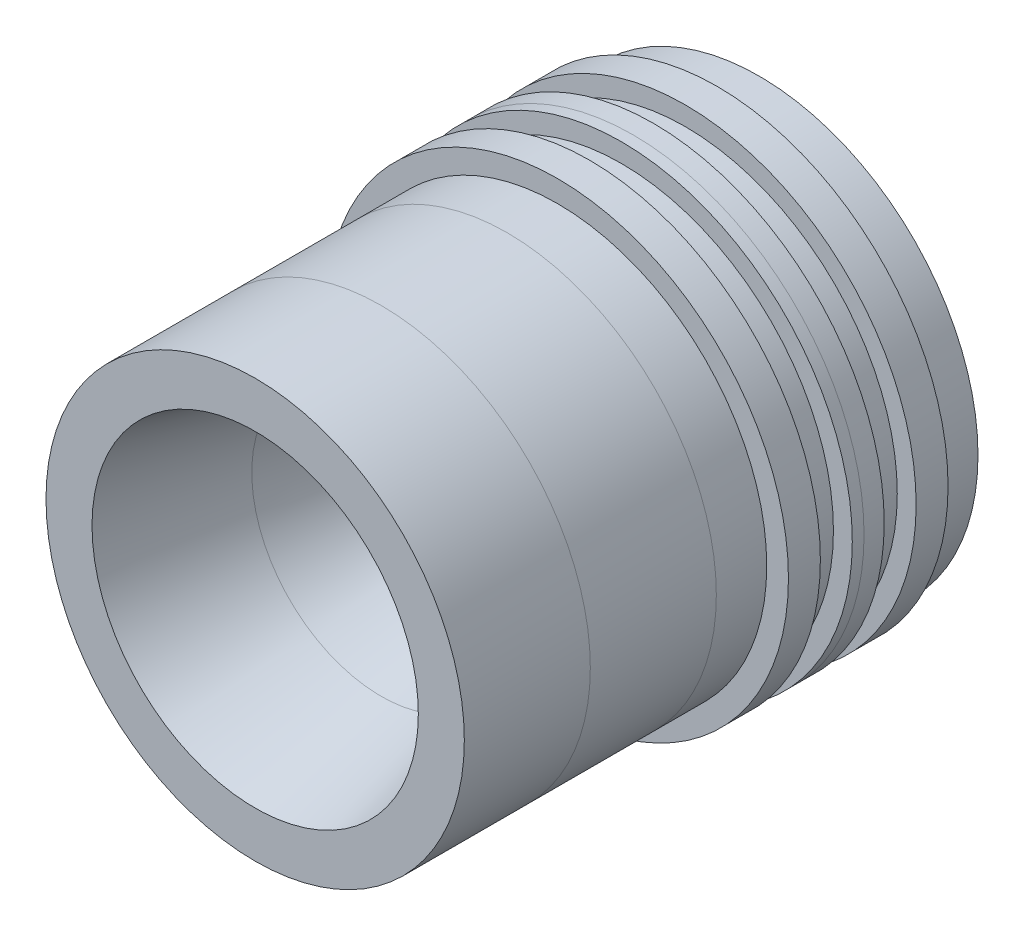
ISO-10303-21;
HEADER;
FILE_DESCRIPTION(('STEP AP214'),'2;1');
FILE_NAME('part.step','',(''),(''),'','','');
FILE_SCHEMA(('AUTOMOTIVE_DESIGN { 1 0 10303 214 1 1 1 1 }'));
ENDSEC;
DATA;
#1=APPLICATION_CONTEXT('core data for automotive mechanical design processes');
#2=APPLICATION_PROTOCOL_DEFINITION('international standard','automotive_design',2000,#1);
#3=PRODUCT_CONTEXT('',#1,'mechanical');
#4=PRODUCT('Part','Part','',(#3));
#5=PRODUCT_RELATED_PRODUCT_CATEGORY('part','',(#4));
#6=PRODUCT_DEFINITION_FORMATION('','',#4);
#7=PRODUCT_DEFINITION_CONTEXT('part definition',#1,'design');
#8=PRODUCT_DEFINITION('design','',#6,#7);
#9=PRODUCT_DEFINITION_SHAPE('','',#8);
#10=(LENGTH_UNIT() NAMED_UNIT(*) SI_UNIT(.MILLI.,.METRE.));
#11=(NAMED_UNIT(*) PLANE_ANGLE_UNIT() SI_UNIT($,.RADIAN.));
#12=(NAMED_UNIT(*) SI_UNIT($,.STERADIAN.) SOLID_ANGLE_UNIT());
#13=UNCERTAINTY_MEASURE_WITH_UNIT(LENGTH_MEASURE(1.E-05),#10,'distance_accuracy_value','');
#14=(GEOMETRIC_REPRESENTATION_CONTEXT(3) GLOBAL_UNCERTAINTY_ASSIGNED_CONTEXT((#13)) GLOBAL_UNIT_ASSIGNED_CONTEXT((#10,
#11,#12)) REPRESENTATION_CONTEXT('',''));
#15=CARTESIAN_POINT('',(0.,0.,0.));
#16=DIRECTION('',(0.,0.,1.));
#17=DIRECTION('',(1.,0.,0.));
#18=AXIS2_PLACEMENT_3D('',#15,#16,#17);
#19=CARTESIAN_POINT('',(0.,0.,-114.3));
#20=DIRECTION('',(0.,0.,1.));
#21=DIRECTION('',(1.,0.,0.));
#22=AXIS2_PLACEMENT_3D('',#19,#20,#21);
#23=PLANE('',#22);
#24=CARTESIAN_POINT('',(0.,0.,-114.3));
#25=DIRECTION('',(0.,0.,1.));
#26=DIRECTION('',(1.,0.,0.));
#27=AXIS2_PLACEMENT_3D('',#24,#25,#26);
#28=CIRCLE('',#27,44.45);
#29=CARTESIAN_POINT('',(44.45,0.,-114.3));
#30=VERTEX_POINT('',#29);
#31=EDGE_CURVE('E57',#30,#30,#28,.F.);
#32=ORIENTED_EDGE('',*,*,#31,.T.);
#33=EDGE_LOOP('',(#32));
#34=FACE_BOUND('',#33,.T.);
#35=CARTESIAN_POINT('',(0.,0.,-114.3));
#36=DIRECTION('',(0.,0.,1.));
#37=DIRECTION('',(1.,0.,0.));
#38=AXIS2_PLACEMENT_3D('',#35,#36,#37);
#39=CIRCLE('',#38,69.8119);
#40=CARTESIAN_POINT('',(69.8119,0.,-114.3));
#41=VERTEX_POINT('',#40);
#42=EDGE_CURVE('E80',#41,#41,#39,.F.);
#43=ORIENTED_EDGE('',*,*,#42,.F.);
#44=EDGE_LOOP('',(#43));
#45=FACE_BOUND('',#44,.T.);
#46=ADVANCED_FACE('F53',(#34,#45),#23,.T.);
#47=CARTESIAN_POINT('',(0.,0.,8.14522565701556));
#48=DIRECTION('',(0.,0.,1.));
#49=DIRECTION('',(1.,0.,0.));
#50=AXIS2_PLACEMENT_3D('',#47,#48,#49);
#51=CYLINDRICAL_SURFACE('',#50,69.8119);
#52=CARTESIAN_POINT('',(0.,0.,-130.048));
#53=DIRECTION('',(0.,0.,-1.));
#54=DIRECTION('',(-1.,0.,0.));
#55=AXIS2_PLACEMENT_3D('',#52,#53,#54);
#56=CIRCLE('',#55,69.8119);
#57=CARTESIAN_POINT('',(-69.8119,0.,-130.048));
#58=VERTEX_POINT('',#57);
#59=EDGE_CURVE('E72',#58,#58,#56,.F.);
#60=ORIENTED_EDGE('',*,*,#59,.F.);
#61=EDGE_LOOP('',(#60));
#62=FACE_BOUND('',#61,.T.);
#63=CARTESIAN_POINT('',(0.,0.,-139.7));
#64=DIRECTION('',(0.,0.,1.));
#65=DIRECTION('',(1.,0.,0.));
#66=AXIS2_PLACEMENT_3D('',#63,#64,#65);
#67=CIRCLE('',#66,69.8119);
#68=CARTESIAN_POINT('',(69.8119,0.,-139.7));
#69=VERTEX_POINT('',#68);
#70=EDGE_CURVE('E76',#69,#69,#67,.T.);
#71=ORIENTED_EDGE('',*,*,#70,.T.);
#72=EDGE_LOOP('',(#71));
#73=FACE_BOUND('',#72,.T.);
#74=ADVANCED_FACE('F55',(#62,#73),#51,.T.);
#75=CARTESIAN_POINT('',(64.1096,0.,-130.048));
#76=DIRECTION('',(0.,0.,-1.));
#77=DIRECTION('',(-1.,0.,0.));
#78=AXIS2_PLACEMENT_3D('',#75,#76,#77);
#79=PLANE('',#78);
#80=ORIENTED_EDGE('',*,*,#59,.T.);
#81=EDGE_LOOP('',(#80));
#82=FACE_BOUND('',#81,.T.);
#83=CARTESIAN_POINT('',(0.,0.,-130.048));
#84=DIRECTION('',(0.,0.,1.));
#85=DIRECTION('',(1.,0.,0.));
#86=AXIS2_PLACEMENT_3D('',#83,#84,#85);
#87=CIRCLE('',#86,64.1096);
#88=CARTESIAN_POINT('',(64.1096,0.,-130.048));
#89=VERTEX_POINT('',#88);
#90=EDGE_CURVE('E61',#89,#89,#87,.T.);
#91=ORIENTED_EDGE('',*,*,#90,.F.);
#92=EDGE_LOOP('',(#91));
#93=FACE_BOUND('',#92,.T.);
#94=ADVANCED_FACE('F109',(#82,#93),#79,.F.);
#95=CARTESIAN_POINT('',(0.,0.,8.14522565701556));
#96=DIRECTION('',(0.,0.,1.));
#97=DIRECTION('',(1.,0.,0.));
#98=AXIS2_PLACEMENT_3D('',#95,#96,#97);
#99=CYLINDRICAL_SURFACE('',#98,64.1096);
#100=CARTESIAN_POINT('',(0.,0.,-120.396));
#101=DIRECTION('',(0.,0.,1.));
#102=DIRECTION('',(1.,0.,0.));
#103=AXIS2_PLACEMENT_3D('',#100,#101,#102);
#104=CIRCLE('',#103,64.1096);
#105=CARTESIAN_POINT('',(64.1096,0.,-120.396));
#106=VERTEX_POINT('',#105);
#107=EDGE_CURVE('E66',#106,#106,#104,.T.);
#108=ORIENTED_EDGE('',*,*,#107,.F.);
#109=EDGE_LOOP('',(#108));
#110=FACE_BOUND('',#109,.T.);
#111=ORIENTED_EDGE('',*,*,#90,.T.);
#112=EDGE_LOOP('',(#111));
#113=FACE_BOUND('',#112,.T.);
#114=ADVANCED_FACE('F115',(#110,#113),#99,.T.);
#115=CARTESIAN_POINT('',(64.1096,0.,-120.396));
#116=DIRECTION('',(0.,0.,1.));
#117=DIRECTION('',(1.,0.,0.));
#118=AXIS2_PLACEMENT_3D('',#115,#116,#117);
#119=PLANE('',#118);
#120=CARTESIAN_POINT('',(0.,0.,-120.396));
#121=DIRECTION('',(0.,0.,1.));
#122=DIRECTION('',(1.,0.,0.));
#123=AXIS2_PLACEMENT_3D('',#120,#121,#122);
#124=CIRCLE('',#123,69.8119);
#125=CARTESIAN_POINT('',(69.8119,0.,-120.396));
#126=VERTEX_POINT('',#125);
#127=EDGE_CURVE('E69',#126,#126,#124,.F.);
#128=ORIENTED_EDGE('',*,*,#127,.T.);
#129=EDGE_LOOP('',(#128));
#130=FACE_BOUND('',#129,.T.);
#131=ORIENTED_EDGE('',*,*,#107,.T.);
#132=EDGE_LOOP('',(#131));
#133=FACE_BOUND('',#132,.T.);
#134=ADVANCED_FACE('F122',(#130,#133),#119,.F.);
#135=ORIENTED_EDGE('',*,*,#127,.F.);
#136=EDGE_LOOP('',(#135));
#137=FACE_BOUND('',#136,.T.);
#138=ORIENTED_EDGE('',*,*,#42,.T.);
#139=EDGE_LOOP('',(#138));
#140=FACE_BOUND('',#139,.T.);
#141=ADVANCED_FACE('F111',(#137,#140),#51,.T.);
#142=CARTESIAN_POINT('',(69.8119,0.,-139.7));
#143=DIRECTION('',(0.,0.,-1.));
#144=DIRECTION('',(-1.,0.,0.));
#145=AXIS2_PLACEMENT_3D('',#142,#143,#144);
#146=PLANE('',#145);
#147=CARTESIAN_POINT('',(0.,0.,-139.7));
#148=DIRECTION('',(0.,0.,1.));
#149=DIRECTION('',(1.,0.,0.));
#150=AXIS2_PLACEMENT_3D('',#147,#148,#149);
#151=CIRCLE('',#150,66.167);
#152=CARTESIAN_POINT('',(66.167,0.,-139.7));
#153=VERTEX_POINT('',#152);
#154=EDGE_CURVE('E73',#153,#153,#151,.T.);
#155=ORIENTED_EDGE('',*,*,#154,.T.);
#156=EDGE_LOOP('',(#155));
#157=FACE_BOUND('',#156,.T.);
#158=ORIENTED_EDGE('',*,*,#70,.F.);
#159=EDGE_LOOP('',(#158));
#160=FACE_BOUND('',#159,.T.);
#161=ADVANCED_FACE('F121',(#157,#160),#146,.T.);
#162=CARTESIAN_POINT('',(0.,0.,8.14522565701556));
#163=DIRECTION('',(0.,0.,1.));
#164=DIRECTION('',(1.,0.,0.));
#165=AXIS2_PLACEMENT_3D('',#162,#163,#164);
#166=CYLINDRICAL_SURFACE('',#165,66.167);
#167=CARTESIAN_POINT('',(0.,0.,-152.4));
#168=DIRECTION('',(0.,0.,1.));
#169=DIRECTION('',(1.,0.,0.));
#170=AXIS2_PLACEMENT_3D('',#167,#168,#169);
#171=CIRCLE('',#170,66.167);
#172=CARTESIAN_POINT('',(66.167,0.,-152.4));
#173=VERTEX_POINT('',#172);
#174=EDGE_CURVE('E83',#173,#173,#171,.T.);
#175=ORIENTED_EDGE('',*,*,#174,.T.);
#176=EDGE_LOOP('',(#175));
#177=FACE_BOUND('',#176,.T.);
#178=ORIENTED_EDGE('',*,*,#154,.F.);
#179=EDGE_LOOP('',(#178));
#180=FACE_BOUND('',#179,.T.);
#181=ADVANCED_FACE('F128',(#177,#180),#166,.T.);
#182=CARTESIAN_POINT('',(66.167,0.,-152.4));
#183=DIRECTION('',(0.,0.,-1.));
#184=DIRECTION('',(-1.,0.,0.));
#185=AXIS2_PLACEMENT_3D('',#182,#183,#184);
#186=PLANE('',#185);
#187=CARTESIAN_POINT('',(0.,0.,-152.4));
#188=DIRECTION('',(0.,0.,1.));
#189=DIRECTION('',(1.,0.,0.));
#190=AXIS2_PLACEMENT_3D('',#187,#188,#189);
#191=CIRCLE('',#190,59.817);
#192=CARTESIAN_POINT('',(59.817,0.,-152.4));
#193=VERTEX_POINT('',#192);
#194=EDGE_CURVE('E79',#193,#193,#191,.T.);
#195=ORIENTED_EDGE('',*,*,#194,.T.);
#196=EDGE_LOOP('',(#195));
#197=FACE_BOUND('',#196,.T.);
#198=ORIENTED_EDGE('',*,*,#174,.F.);
#199=EDGE_LOOP('',(#198));
#200=FACE_BOUND('',#199,.T.);
#201=ADVANCED_FACE('F103',(#197,#200),#186,.T.);
#202=CARTESIAN_POINT('',(0.,0.,-152.4));
#203=DIRECTION('',(0.,0.,-1.));
#204=DIRECTION('',(-1.,0.,0.));
#205=AXIS2_PLACEMENT_3D('',#202,#203,#204);
#206=CONICAL_SURFACE('',#205,59.817,1.0471975511966);
#207=CARTESIAN_POINT('',(0.,0.,-143.527858413363));
#208=DIRECTION('',(0.,0.,-1.));
#209=DIRECTION('',(-1.,0.,0.));
#210=AXIS2_PLACEMENT_3D('',#207,#208,#209);
#211=CIRCLE('',#210,44.45);
#212=CARTESIAN_POINT('',(-44.45,0.,-143.527858413363));
#213=VERTEX_POINT('',#212);
#214=EDGE_CURVE('E12',#213,#213,#211,.T.);
#215=ORIENTED_EDGE('',*,*,#214,.F.);
#216=EDGE_LOOP('',(#215));
#217=FACE_BOUND('',#216,.T.);
#218=ORIENTED_EDGE('',*,*,#194,.F.);
#219=EDGE_LOOP('',(#218));
#220=FACE_BOUND('',#219,.T.);
#221=ADVANCED_FACE('F99',(#217,#220),#206,.F.);
#222=CARTESIAN_POINT('',(0.,0.,8.14522565701556));
#223=DIRECTION('',(0.,0.,1.));
#224=DIRECTION('',(1.,0.,0.));
#225=AXIS2_PLACEMENT_3D('',#222,#223,#224);
#226=CYLINDRICAL_SURFACE('',#225,44.45);
#227=ORIENTED_EDGE('',*,*,#214,.T.);
#228=EDGE_LOOP('',(#227));
#229=FACE_BOUND('',#228,.T.);
#230=ORIENTED_EDGE('',*,*,#31,.F.);
#231=EDGE_LOOP('',(#230));
#232=FACE_BOUND('',#231,.T.);
#233=ADVANCED_FACE('F97',(#229,#232),#226,.F.);
#234=CLOSED_SHELL('',(#46,#74,#94,#114,#134,#141,#161,#181,#201,#221,#233));
#235=MANIFOLD_SOLID_BREP('B2',#234);
#236=CARTESIAN_POINT('',(0.,0.,-76.2));
#237=DIRECTION('',(0.,0.,1.));
#238=DIRECTION('',(1.,0.,0.));
#239=AXIS2_PLACEMENT_3D('',#236,#237,#238);
#240=PLANE('',#239);
#241=CARTESIAN_POINT('',(0.,0.,-76.2));
#242=DIRECTION('',(0.,0.,1.));
#243=DIRECTION('',(1.,0.,0.));
#244=AXIS2_PLACEMENT_3D('',#241,#242,#243);
#245=CIRCLE('',#244,63.246);
#246=CARTESIAN_POINT('',(63.246,0.,-76.2));
#247=VERTEX_POINT('',#246);
#248=EDGE_CURVE('E248',#247,#247,#245,.F.);
#249=ORIENTED_EDGE('',*,*,#248,.T.);
#250=EDGE_LOOP('',(#249));
#251=FACE_BOUND('',#250,.T.);
#252=CARTESIAN_POINT('',(0.,0.,-76.2));
#253=DIRECTION('',(0.,0.,1.));
#254=DIRECTION('',(1.,0.,0.));
#255=AXIS2_PLACEMENT_3D('',#252,#253,#254);
#256=CIRCLE('',#255,28.919574243207);
#257=CARTESIAN_POINT('',(28.919574243207,0.,-76.2));
#258=VERTEX_POINT('',#257);
#259=EDGE_CURVE('E253',#258,#258,#256,.T.);
#260=ORIENTED_EDGE('',*,*,#259,.T.);
#261=EDGE_LOOP('',(#260));
#262=FACE_BOUND('',#261,.T.);
#263=ADVANCED_FACE('F235',(#251,#262),#240,.F.);
#264=CARTESIAN_POINT('',(0.,0.,-38.1));
#265=DIRECTION('',(0.,0.,1.));
#266=DIRECTION('',(1.,0.,0.));
#267=AXIS2_PLACEMENT_3D('',#264,#265,#266);
#268=PLANE('',#267);
#269=CARTESIAN_POINT('',(0.,0.,-38.1));
#270=DIRECTION('',(0.,0.,1.));
#271=DIRECTION('',(1.,0.,0.));
#272=AXIS2_PLACEMENT_3D('',#269,#270,#271);
#273=CIRCLE('',#272,39.1284384748328);
#274=CARTESIAN_POINT('',(39.1284384748328,0.,-38.1));
#275=VERTEX_POINT('',#274);
#276=EDGE_CURVE('E52',#275,#275,#273,.T.);
#277=ORIENTED_EDGE('',*,*,#276,.F.);
#278=EDGE_LOOP('',(#277));
#279=FACE_BOUND('',#278,.T.);
#280=CARTESIAN_POINT('',(0.,0.,-38.1));
#281=DIRECTION('',(0.,0.,1.));
#282=DIRECTION('',(1.,0.,0.));
#283=AXIS2_PLACEMENT_3D('',#280,#281,#282);
#284=CIRCLE('',#283,63.246);
#285=CARTESIAN_POINT('',(63.246,0.,-38.1));
#286=VERTEX_POINT('',#285);
#287=EDGE_CURVE('E243',#286,#286,#284,.F.);
#288=ORIENTED_EDGE('',*,*,#287,.F.);
#289=EDGE_LOOP('',(#288));
#290=FACE_BOUND('',#289,.T.);
#291=ADVANCED_FACE('F263',(#279,#290),#268,.T.);
#292=CARTESIAN_POINT('',(0.,0.,-120.14330931314));
#293=DIRECTION('',(0.,0.,1.));
#294=DIRECTION('',(1.,0.,0.));
#295=AXIS2_PLACEMENT_3D('',#292,#293,#294);
#296=CONICAL_SURFACE('',#295,17.145,0.26179938779915);
#297=ORIENTED_EDGE('',*,*,#259,.F.);
#298=EDGE_LOOP('',(#297));
#299=FACE_BOUND('',#298,.T.);
#300=ORIENTED_EDGE('',*,*,#276,.T.);
#301=EDGE_LOOP('',(#300));
#302=FACE_BOUND('',#301,.T.);
#303=ADVANCED_FACE('F261',(#299,#302),#296,.F.);
#304=CARTESIAN_POINT('',(0.,0.,8.14522565701556));
#305=DIRECTION('',(0.,0.,1.));
#306=DIRECTION('',(1.,0.,0.));
#307=AXIS2_PLACEMENT_3D('',#304,#305,#306);
#308=CYLINDRICAL_SURFACE('',#307,63.246);
#309=ORIENTED_EDGE('',*,*,#248,.F.);
#310=EDGE_LOOP('',(#309));
#311=FACE_BOUND('',#310,.T.);
#312=ORIENTED_EDGE('',*,*,#287,.T.);
#313=EDGE_LOOP('',(#312));
#314=FACE_BOUND('',#313,.T.);
#315=ADVANCED_FACE('F237',(#311,#314),#308,.T.);
#316=CLOSED_SHELL('',(#263,#291,#303,#315));
#317=MANIFOLD_SOLID_BREP('B7',#316);
#318=CARTESIAN_POINT('',(0.,0.,-38.1));
#319=DIRECTION('',(0.,0.,1.));
#320=DIRECTION('',(1.,0.,0.));
#321=AXIS2_PLACEMENT_3D('',#318,#319,#320);
#322=PLANE('',#321);
#323=CARTESIAN_POINT('',(0.,0.,-38.1));
#324=DIRECTION('',(0.,0.,1.));
#325=DIRECTION('',(1.,0.,0.));
#326=AXIS2_PLACEMENT_3D('',#323,#324,#325);
#327=CIRCLE('',#326,63.246);
#328=CARTESIAN_POINT('',(63.246,0.,-38.1));
#329=VERTEX_POINT('',#328);
#330=EDGE_CURVE('E321',#329,#329,#327,.F.);
#331=ORIENTED_EDGE('',*,*,#330,.T.);
#332=EDGE_LOOP('',(#331));
#333=FACE_BOUND('',#332,.T.);
#334=CARTESIAN_POINT('',(0.,0.,-38.1));
#335=DIRECTION('',(0.,0.,1.));
#336=DIRECTION('',(1.,0.,0.));
#337=AXIS2_PLACEMENT_3D('',#334,#335,#336);
#338=CIRCLE('',#337,39.1284384748328);
#339=CARTESIAN_POINT('',(39.1284384748328,0.,-38.1));
#340=VERTEX_POINT('',#339);
#341=EDGE_CURVE('E312',#340,#340,#338,.T.);
#342=ORIENTED_EDGE('',*,*,#341,.T.);
#343=EDGE_LOOP('',(#342));
#344=FACE_BOUND('',#343,.T.);
#345=ADVANCED_FACE('F308',(#333,#344),#322,.F.);
#346=CARTESIAN_POINT('',(49.3373027064587,0.,0.));
#347=DIRECTION('',(0.,0.,1.));
#348=DIRECTION('',(1.,0.,0.));
#349=AXIS2_PLACEMENT_3D('',#346,#347,#348);
#350=PLANE('',#349);
#351=CARTESIAN_POINT('',(0.,0.,0.));
#352=DIRECTION('',(0.,0.,1.));
#353=DIRECTION('',(1.,0.,0.));
#354=AXIS2_PLACEMENT_3D('',#351,#352,#353);
#355=CIRCLE('',#354,63.246);
#356=CARTESIAN_POINT('',(63.246,0.,0.));
#357=VERTEX_POINT('',#356);
#358=EDGE_CURVE('E316',#357,#357,#355,.T.);
#359=ORIENTED_EDGE('',*,*,#358,.T.);
#360=EDGE_LOOP('',(#359));
#361=FACE_BOUND('',#360,.T.);
#362=CARTESIAN_POINT('',(0.,0.,0.));
#363=DIRECTION('',(0.,0.,1.));
#364=DIRECTION('',(1.,0.,0.));
#365=AXIS2_PLACEMENT_3D('',#362,#363,#364);
#366=CIRCLE('',#365,49.3373027064587);
#367=CARTESIAN_POINT('',(49.3373027064587,0.,0.));
#368=VERTEX_POINT('',#367);
#369=EDGE_CURVE('E234',#368,#368,#366,.T.);
#370=ORIENTED_EDGE('',*,*,#369,.F.);
#371=EDGE_LOOP('',(#370));
#372=FACE_BOUND('',#371,.T.);
#373=ADVANCED_FACE('F332',(#361,#372),#350,.T.);
#374=CARTESIAN_POINT('',(0.,0.,-120.14330931314));
#375=DIRECTION('',(0.,0.,1.));
#376=DIRECTION('',(1.,0.,0.));
#377=AXIS2_PLACEMENT_3D('',#374,#375,#376);
#378=CONICAL_SURFACE('',#377,17.145,0.26179938779915);
#379=ORIENTED_EDGE('',*,*,#341,.F.);
#380=EDGE_LOOP('',(#379));
#381=FACE_BOUND('',#380,.T.);
#382=ORIENTED_EDGE('',*,*,#369,.T.);
#383=EDGE_LOOP('',(#382));
#384=FACE_BOUND('',#383,.T.);
#385=ADVANCED_FACE('F330',(#381,#384),#378,.F.);
#386=CARTESIAN_POINT('',(0.,0.,8.14522565701556));
#387=DIRECTION('',(0.,0.,1.));
#388=DIRECTION('',(1.,0.,0.));
#389=AXIS2_PLACEMENT_3D('',#386,#387,#388);
#390=CYLINDRICAL_SURFACE('',#389,63.246);
#391=ORIENTED_EDGE('',*,*,#330,.F.);
#392=EDGE_LOOP('',(#391));
#393=FACE_BOUND('',#392,.T.);
#394=ORIENTED_EDGE('',*,*,#358,.F.);
#395=EDGE_LOOP('',(#394));
#396=FACE_BOUND('',#395,.T.);
#397=ADVANCED_FACE('F310',(#393,#396),#390,.T.);
#398=CLOSED_SHELL('',(#345,#373,#385,#397));
#399=MANIFOLD_SOLID_BREP('B47',#398);
#400=CARTESIAN_POINT('',(0.,0.,-114.3));
#401=DIRECTION('',(0.,0.,1.));
#402=DIRECTION('',(1.,0.,0.));
#403=AXIS2_PLACEMENT_3D('',#400,#401,#402);
#404=PLANE('',#403);
#405=CARTESIAN_POINT('',(0.,0.,-114.3));
#406=DIRECTION('',(0.,0.,1.));
#407=DIRECTION('',(1.,0.,0.));
#408=AXIS2_PLACEMENT_3D('',#405,#406,#407);
#409=CIRCLE('',#408,69.8119);
#410=CARTESIAN_POINT('',(69.8119,0.,-114.3));
#411=VERTEX_POINT('',#410);
#412=EDGE_CURVE('E307',#411,#411,#409,.F.);
#413=ORIENTED_EDGE('',*,*,#412,.T.);
#414=EDGE_LOOP('',(#413));
#415=FACE_BOUND('',#414,.T.);
#416=CARTESIAN_POINT('',(0.,0.,-114.3));
#417=DIRECTION('',(0.,0.,1.));
#418=DIRECTION('',(1.,0.,0.));
#419=AXIS2_PLACEMENT_3D('',#416,#417,#418);
#420=CIRCLE('',#419,44.45);
#421=CARTESIAN_POINT('',(44.45,0.,-114.3));
#422=VERTEX_POINT('',#421);
#423=EDGE_CURVE('E385',#422,#422,#420,.F.);
#424=ORIENTED_EDGE('',*,*,#423,.F.);
#425=EDGE_LOOP('',(#424));
#426=FACE_BOUND('',#425,.T.);
#427=ADVANCED_FACE('F370',(#415,#426),#404,.F.);
#428=CARTESIAN_POINT('',(0.,0.,-76.2));
#429=DIRECTION('',(0.,0.,1.));
#430=DIRECTION('',(1.,0.,0.));
#431=AXIS2_PLACEMENT_3D('',#428,#429,#430);
#432=PLANE('',#431);
#433=CARTESIAN_POINT('',(0.,0.,-76.2));
#434=DIRECTION('',(0.,0.,1.));
#435=DIRECTION('',(1.,0.,0.));
#436=AXIS2_PLACEMENT_3D('',#433,#434,#435);
#437=CIRCLE('',#436,28.919574243207);
#438=CARTESIAN_POINT('',(28.919574243207,0.,-76.2));
#439=VERTEX_POINT('',#438);
#440=EDGE_CURVE('E381',#439,#439,#437,.T.);
#441=ORIENTED_EDGE('',*,*,#440,.F.);
#442=EDGE_LOOP('',(#441));
#443=FACE_BOUND('',#442,.T.);
#444=CARTESIAN_POINT('',(0.,0.,-76.2));
#445=DIRECTION('',(0.,0.,1.));
#446=DIRECTION('',(1.,0.,0.));
#447=AXIS2_PLACEMENT_3D('',#444,#445,#446);
#448=CIRCLE('',#447,63.246);
#449=CARTESIAN_POINT('',(63.246,0.,-76.2));
#450=VERTEX_POINT('',#449);
#451=EDGE_CURVE('E374',#450,#450,#448,.F.);
#452=ORIENTED_EDGE('',*,*,#451,.F.);
#453=EDGE_LOOP('',(#452));
#454=FACE_BOUND('',#453,.T.);
#455=ADVANCED_FACE('F372',(#443,#454),#432,.T.);
#456=CARTESIAN_POINT('',(0.,0.,-76.2013093131404));
#457=DIRECTION('',(0.,0.,1.));
#458=DIRECTION('',(1.,0.,0.));
#459=AXIS2_PLACEMENT_3D('',#456,#457,#458);
#460=PLANE('',#459);
#461=CARTESIAN_POINT('',(0.,0.,-76.2013093131404));
#462=DIRECTION('',(0.,0.,1.));
#463=DIRECTION('',(1.,0.,0.));
#464=AXIS2_PLACEMENT_3D('',#461,#462,#463);
#465=CIRCLE('',#464,28.9192234138084);
#466=CARTESIAN_POINT('',(28.9192234138084,0.,-76.2013093131404));
#467=VERTEX_POINT('',#466);
#468=EDGE_CURVE('E389',#467,#467,#465,.T.);
#469=ORIENTED_EDGE('',*,*,#468,.T.);
#470=EDGE_LOOP('',(#469));
#471=FACE_BOUND('',#470,.T.);
#472=CARTESIAN_POINT('',(0.,0.,-76.2013093131404));
#473=DIRECTION('',(0.,0.,1.));
#474=DIRECTION('',(1.,0.,0.));
#475=AXIS2_PLACEMENT_3D('',#472,#473,#474);
#476=CIRCLE('',#475,44.45);
#477=CARTESIAN_POINT('',(44.45,0.,-76.2013093131404));
#478=VERTEX_POINT('',#477);
#479=EDGE_CURVE('E393',#478,#478,#476,.T.);
#480=ORIENTED_EDGE('',*,*,#479,.F.);
#481=EDGE_LOOP('',(#480));
#482=FACE_BOUND('',#481,.T.);
#483=ADVANCED_FACE('F415',(#471,#482),#460,.F.);
#484=CARTESIAN_POINT('',(0.,0.,8.14522565701556));
#485=DIRECTION('',(0.,0.,1.));
#486=DIRECTION('',(1.,0.,0.));
#487=AXIS2_PLACEMENT_3D('',#484,#485,#486);
#488=CYLINDRICAL_SURFACE('',#487,44.45);
#489=ORIENTED_EDGE('',*,*,#423,.T.);
#490=EDGE_LOOP('',(#489));
#491=FACE_BOUND('',#490,.T.);
#492=ORIENTED_EDGE('',*,*,#479,.T.);
#493=EDGE_LOOP('',(#492));
#494=FACE_BOUND('',#493,.T.);
#495=ADVANCED_FACE('F413',(#491,#494),#488,.F.);
#496=CARTESIAN_POINT('',(0.,0.,-120.14330931314));
#497=DIRECTION('',(0.,0.,1.));
#498=DIRECTION('',(1.,0.,0.));
#499=AXIS2_PLACEMENT_3D('',#496,#497,#498);
#500=CONICAL_SURFACE('',#499,17.145,0.26179938779915);
#501=ORIENTED_EDGE('',*,*,#468,.F.);
#502=EDGE_LOOP('',(#501));
#503=FACE_BOUND('',#502,.T.);
#504=ORIENTED_EDGE('',*,*,#440,.T.);
#505=EDGE_LOOP('',(#504));
#506=FACE_BOUND('',#505,.T.);
#507=ADVANCED_FACE('F423',(#503,#506),#500,.F.);
#508=CARTESIAN_POINT('',(64.1096,0.,-101.092));
#509=DIRECTION('',(0.,0.,1.));
#510=DIRECTION('',(1.,0.,0.));
#511=AXIS2_PLACEMENT_3D('',#508,#509,#510);
#512=PLANE('',#511);
#513=CARTESIAN_POINT('',(0.,0.,-101.092));
#514=DIRECTION('',(0.,0.,1.));
#515=DIRECTION('',(1.,0.,0.));
#516=AXIS2_PLACEMENT_3D('',#513,#514,#515);
#517=CIRCLE('',#516,69.8119);
#518=CARTESIAN_POINT('',(69.8119,0.,-101.092));
#519=VERTEX_POINT('',#518);
#520=EDGE_CURVE('E394',#519,#519,#517,.F.);
#521=ORIENTED_EDGE('',*,*,#520,.T.);
#522=EDGE_LOOP('',(#521));
#523=FACE_BOUND('',#522,.T.);
#524=CARTESIAN_POINT('',(0.,0.,-101.092));
#525=DIRECTION('',(0.,0.,1.));
#526=DIRECTION('',(1.,0.,0.));
#527=AXIS2_PLACEMENT_3D('',#524,#525,#526);
#528=CIRCLE('',#527,64.1096);
#529=CARTESIAN_POINT('',(64.1096,0.,-101.092));
#530=VERTEX_POINT('',#529);
#531=EDGE_CURVE('E401',#530,#530,#528,.T.);
#532=ORIENTED_EDGE('',*,*,#531,.T.);
#533=EDGE_LOOP('',(#532));
#534=FACE_BOUND('',#533,.T.);
#535=ADVANCED_FACE('F449',(#523,#534),#512,.F.);
#536=CARTESIAN_POINT('',(0.,0.,8.14522565701556));
#537=DIRECTION('',(0.,0.,1.));
#538=DIRECTION('',(1.,0.,0.));
#539=AXIS2_PLACEMENT_3D('',#536,#537,#538);
#540=CYLINDRICAL_SURFACE('',#539,64.1096);
#541=ORIENTED_EDGE('',*,*,#531,.F.);
#542=EDGE_LOOP('',(#541));
#543=FACE_BOUND('',#542,.T.);
#544=CARTESIAN_POINT('',(0.,0.,-110.744));
#545=DIRECTION('',(0.,0.,1.));
#546=DIRECTION('',(1.,0.,0.));
#547=AXIS2_PLACEMENT_3D('',#544,#545,#546);
#548=CIRCLE('',#547,64.1096);
#549=CARTESIAN_POINT('',(64.1096,0.,-110.744));
#550=VERTEX_POINT('',#549);
#551=EDGE_CURVE('E392',#550,#550,#548,.T.);
#552=ORIENTED_EDGE('',*,*,#551,.T.);
#553=EDGE_LOOP('',(#552));
#554=FACE_BOUND('',#553,.T.);
#555=ADVANCED_FACE('F451',(#543,#554),#540,.T.);
#556=CARTESIAN_POINT('',(64.1096,0.,-110.744));
#557=DIRECTION('',(0.,0.,-1.));
#558=DIRECTION('',(-1.,0.,0.));
#559=AXIS2_PLACEMENT_3D('',#556,#557,#558);
#560=PLANE('',#559);
#561=CARTESIAN_POINT('',(0.,0.,-110.744));
#562=DIRECTION('',(0.,0.,-1.));
#563=DIRECTION('',(-1.,0.,0.));
#564=AXIS2_PLACEMENT_3D('',#561,#562,#563);
#565=CIRCLE('',#564,69.8119);
#566=CARTESIAN_POINT('',(-69.8119,0.,-110.744));
#567=VERTEX_POINT('',#566);
#568=EDGE_CURVE('E398',#567,#567,#565,.F.);
#569=ORIENTED_EDGE('',*,*,#568,.T.);
#570=EDGE_LOOP('',(#569));
#571=FACE_BOUND('',#570,.T.);
#572=ORIENTED_EDGE('',*,*,#551,.F.);
#573=EDGE_LOOP('',(#572));
#574=FACE_BOUND('',#573,.T.);
#575=ADVANCED_FACE('F438',(#571,#574),#560,.F.);
#576=CARTESIAN_POINT('',(0.,0.,8.14522565701556));
#577=DIRECTION('',(0.,0.,1.));
#578=DIRECTION('',(1.,0.,0.));
#579=AXIS2_PLACEMENT_3D('',#576,#577,#578);
#580=CYLINDRICAL_SURFACE('',#579,69.8119);
#581=ORIENTED_EDGE('',*,*,#412,.F.);
#582=EDGE_LOOP('',(#581));
#583=FACE_BOUND('',#582,.T.);
#584=ORIENTED_EDGE('',*,*,#568,.F.);
#585=EDGE_LOOP('',(#584));
#586=FACE_BOUND('',#585,.T.);
#587=ADVANCED_FACE('F434',(#583,#586),#580,.T.);
#588=ORIENTED_EDGE('',*,*,#520,.F.);
#589=EDGE_LOOP('',(#588));
#590=FACE_BOUND('',#589,.T.);
#591=CARTESIAN_POINT('',(0.,0.,-91.44));
#592=DIRECTION('',(0.,0.,1.));
#593=DIRECTION('',(1.,0.,0.));
#594=AXIS2_PLACEMENT_3D('',#591,#592,#593);
#595=CIRCLE('',#594,69.8119);
#596=CARTESIAN_POINT('',(69.8119,0.,-91.44));
#597=VERTEX_POINT('',#596);
#598=EDGE_CURVE('E388',#597,#597,#595,.T.);
#599=ORIENTED_EDGE('',*,*,#598,.F.);
#600=EDGE_LOOP('',(#599));
#601=FACE_BOUND('',#600,.T.);
#602=ADVANCED_FACE('F437',(#590,#601),#580,.T.);
#603=CARTESIAN_POINT('',(63.246,0.,-91.44));
#604=DIRECTION('',(0.,0.,1.));
#605=DIRECTION('',(1.,0.,0.));
#606=AXIS2_PLACEMENT_3D('',#603,#604,#605);
#607=PLANE('',#606);
#608=ORIENTED_EDGE('',*,*,#598,.T.);
#609=EDGE_LOOP('',(#608));
#610=FACE_BOUND('',#609,.T.);
#611=CARTESIAN_POINT('',(0.,0.,-91.44));
#612=DIRECTION('',(0.,0.,1.));
#613=DIRECTION('',(1.,0.,0.));
#614=AXIS2_PLACEMENT_3D('',#611,#612,#613);
#615=CIRCLE('',#614,63.246);
#616=CARTESIAN_POINT('',(63.246,0.,-91.44));
#617=VERTEX_POINT('',#616);
#618=EDGE_CURVE('E397',#617,#617,#615,.T.);
#619=ORIENTED_EDGE('',*,*,#618,.F.);
#620=EDGE_LOOP('',(#619));
#621=FACE_BOUND('',#620,.T.);
#622=ADVANCED_FACE('F440',(#610,#621),#607,.T.);
#623=CARTESIAN_POINT('',(0.,0.,8.14522565701556));
#624=DIRECTION('',(0.,0.,1.));
#625=DIRECTION('',(1.,0.,0.));
#626=AXIS2_PLACEMENT_3D('',#623,#624,#625);
#627=CYLINDRICAL_SURFACE('',#626,63.246);
#628=ORIENTED_EDGE('',*,*,#618,.T.);
#629=EDGE_LOOP('',(#628));
#630=FACE_BOUND('',#629,.T.);
#631=ORIENTED_EDGE('',*,*,#451,.T.);
#632=EDGE_LOOP('',(#631));
#633=FACE_BOUND('',#632,.T.);
#634=ADVANCED_FACE('F427',(#630,#633),#627,.T.);
#635=CLOSED_SHELL('',(#427,#455,#483,#495,#507,#535,#555,#575,#587,#602,#622,#634));
#636=MANIFOLD_SOLID_BREP('B229',#635);
#637=ADVANCED_BREP_SHAPE_REPRESENTATION('',(#18,#235,#317,#399,#636),#14);
#638=SHAPE_DEFINITION_REPRESENTATION(#9,#637);
ENDSEC;
END-ISO-10303-21;
